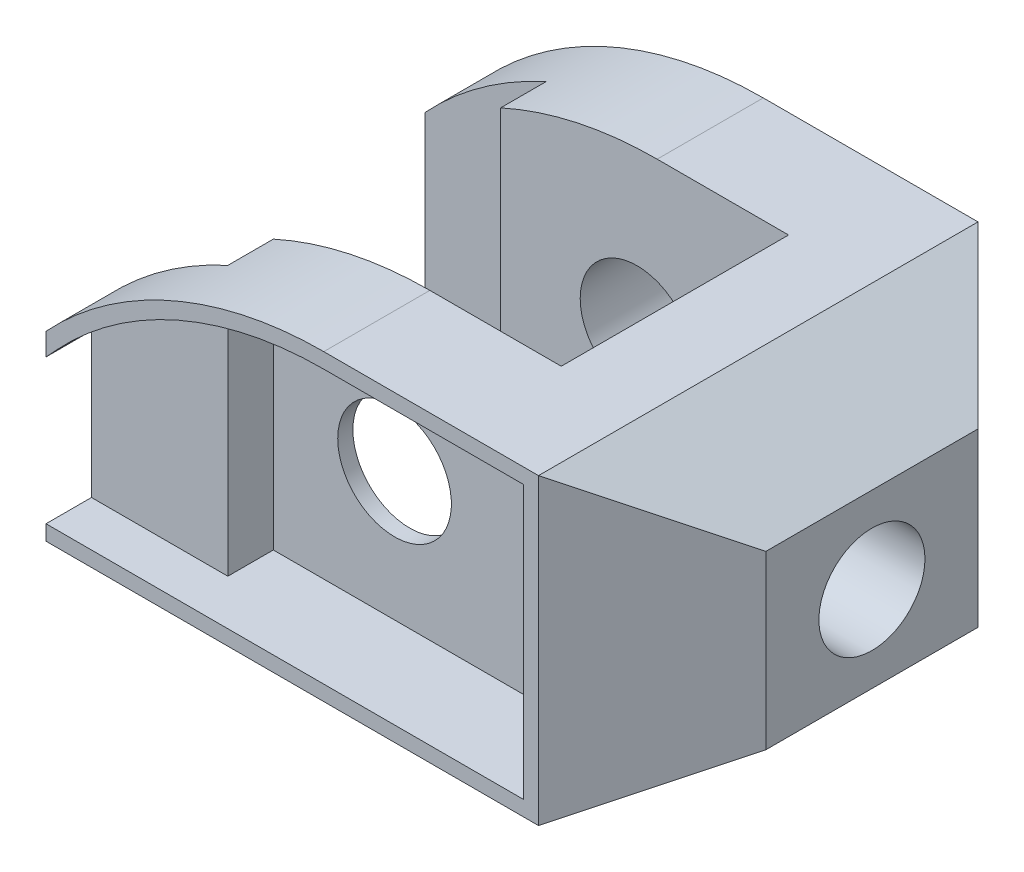
ISO-10303-21;
HEADER;
FILE_DESCRIPTION(('STEP AP214'),'2;1');
FILE_NAME('part.step','',(''),(''),'','','');
FILE_SCHEMA(('AUTOMOTIVE_DESIGN { 1 0 10303 214 1 1 1 1 }'));
ENDSEC;
DATA;
#1=APPLICATION_CONTEXT('core data for automotive mechanical design processes');
#2=APPLICATION_PROTOCOL_DEFINITION('international standard','automotive_design',2000,#1);
#3=PRODUCT_CONTEXT('',#1,'mechanical');
#4=PRODUCT('Part','Part','',(#3));
#5=PRODUCT_RELATED_PRODUCT_CATEGORY('part','',(#4));
#6=PRODUCT_DEFINITION_FORMATION('','',#4);
#7=PRODUCT_DEFINITION_CONTEXT('part definition',#1,'design');
#8=PRODUCT_DEFINITION('design','',#6,#7);
#9=PRODUCT_DEFINITION_SHAPE('','',#8);
#10=(LENGTH_UNIT() NAMED_UNIT(*) SI_UNIT(.MILLI.,.METRE.));
#11=(NAMED_UNIT(*) PLANE_ANGLE_UNIT() SI_UNIT($,.RADIAN.));
#12=(NAMED_UNIT(*) SI_UNIT($,.STERADIAN.) SOLID_ANGLE_UNIT());
#13=UNCERTAINTY_MEASURE_WITH_UNIT(LENGTH_MEASURE(1.E-05),#10,'distance_accuracy_value','');
#14=(GEOMETRIC_REPRESENTATION_CONTEXT(3) GLOBAL_UNCERTAINTY_ASSIGNED_CONTEXT((#13)) GLOBAL_UNIT_ASSIGNED_CONTEXT((#10,
#11,#12)) REPRESENTATION_CONTEXT('',''));
#15=CARTESIAN_POINT('',(0.,0.,0.));
#16=DIRECTION('',(0.,0.,1.));
#17=DIRECTION('',(1.,0.,0.));
#18=AXIS2_PLACEMENT_3D('',#15,#16,#17);
#19=CARTESIAN_POINT('',(36.6606055596467,-10.,58.));
#20=DIRECTION('',(0.,0.,-1.));
#21=DIRECTION('',(-1.,0.,0.));
#22=AXIS2_PLACEMENT_3D('',#19,#20,#21);
#23=PLANE('',#22);
#24=DIRECTION('',(1.,0.,0.));
#25=VECTOR('',#24,1.);
#26=CARTESIAN_POINT('',(0.,2.,58.));
#27=LINE('',#26,#25);
#28=CARTESIAN_POINT('',(0.,2.,58.));
#29=VERTEX_POINT('',#28);
#30=CARTESIAN_POINT('',(63.,2.,58.));
#31=VERTEX_POINT('',#30);
#32=EDGE_CURVE('E253',#29,#31,#27,.T.);
#33=ORIENTED_EDGE('',*,*,#32,.F.);
#34=DIRECTION('',(0.,-1.,0.));
#35=VECTOR('',#34,1.);
#36=CARTESIAN_POINT('',(0.,0.,58.));
#37=LINE('',#36,#35);
#38=CARTESIAN_POINT('',(0.,0.,58.));
#39=VERTEX_POINT('',#38);
#40=EDGE_CURVE('E348',#29,#39,#37,.T.);
#41=ORIENTED_EDGE('',*,*,#40,.T.);
#42=DIRECTION('',(1.,0.,0.));
#43=VECTOR('',#42,1.);
#44=CARTESIAN_POINT('',(0.,0.,58.));
#45=LINE('',#44,#43);
#46=CARTESIAN_POINT('',(65.,0.,58.));
#47=VERTEX_POINT('',#46);
#48=EDGE_CURVE('E347',#39,#47,#45,.T.);
#49=ORIENTED_EDGE('',*,*,#48,.T.);
#50=DIRECTION('',(0.,-1.,0.));
#51=VECTOR('',#50,1.);
#52=CARTESIAN_POINT('',(65.,40.,58.));
#53=LINE('',#52,#51);
#54=CARTESIAN_POINT('',(65.,40.,58.));
#55=VERTEX_POINT('',#54);
#56=EDGE_CURVE('E327',#55,#47,#53,.T.);
#57=ORIENTED_EDGE('',*,*,#56,.F.);
#58=DIRECTION('',(-1.,0.,0.));
#59=VECTOR('',#58,1.);
#60=CARTESIAN_POINT('',(65.,40.,58.));
#61=LINE('',#60,#59);
#62=CARTESIAN_POINT('',(36.6606055596467,40.,58.));
#63=VERTEX_POINT('',#62);
#64=EDGE_CURVE('E351',#55,#63,#61,.T.);
#65=ORIENTED_EDGE('',*,*,#64,.T.);
#66=CARTESIAN_POINT('',(36.6606055596467,-10.,58.));
#67=DIRECTION('',(0.,0.,1.));
#68=DIRECTION('',(-1.,0.,0.));
#69=AXIS2_PLACEMENT_3D('',#66,#67,#68);
#70=CIRCLE('',#69,50.);
#71=CARTESIAN_POINT('',(0.,24.,58.));
#72=VERTEX_POINT('',#71);
#73=EDGE_CURVE('E353',#63,#72,#70,.T.);
#74=ORIENTED_EDGE('',*,*,#73,.T.);
#75=CARTESIAN_POINT('',(0.,21.0588235294118,58.));
#76=VERTEX_POINT('',#75);
#77=EDGE_CURVE('E344',#72,#76,#37,.T.);
#78=ORIENTED_EDGE('',*,*,#77,.T.);
#79=DIRECTION('',(-0.680000000000001,-0.733212111192934,0.));
#80=VECTOR('',#79,1.);
#81=CARTESIAN_POINT('',(-10.4995974322828,9.73760000000002,58.));
#82=LINE('',#81,#80);
#83=CARTESIAN_POINT('',(1.46642422238587,22.64,58.));
#84=VERTEX_POINT('',#83);
#85=EDGE_CURVE('E221',#84,#76,#82,.T.);
#86=ORIENTED_EDGE('',*,*,#85,.F.);
#87=CARTESIAN_POINT('',(36.6606055596467,-10.,58.));
#88=DIRECTION('',(0.,0.,1.));
#89=DIRECTION('',(1.,0.,0.));
#90=AXIS2_PLACEMENT_3D('',#87,#88,#89);
#91=CIRCLE('',#90,48.);
#92=CARTESIAN_POINT('',(36.6606055596467,38.,58.));
#93=VERTEX_POINT('',#92);
#94=EDGE_CURVE('E205',#93,#84,#91,.T.);
#95=ORIENTED_EDGE('',*,*,#94,.F.);
#96=DIRECTION('',(-1.,0.,0.));
#97=VECTOR('',#96,1.);
#98=CARTESIAN_POINT('',(0.,38.,58.));
#99=LINE('',#98,#97);
#100=CARTESIAN_POINT('',(63.,38.,58.));
#101=VERTEX_POINT('',#100);
#102=EDGE_CURVE('E61',#101,#93,#99,.T.);
#103=ORIENTED_EDGE('',*,*,#102,.F.);
#104=DIRECTION('',(0.,1.,0.));
#105=VECTOR('',#104,1.);
#106=CARTESIAN_POINT('',(63.,0.,58.));
#107=LINE('',#106,#105);
#108=EDGE_CURVE('E235',#31,#101,#107,.T.);
#109=ORIENTED_EDGE('',*,*,#108,.F.);
#110=EDGE_LOOP('',(#33,#41,#49,#57,#65,#74,#78,#86,#95,#103,#109));
#111=FACE_BOUND('',#110,.T.);
#112=ADVANCED_FACE('F38',(#111),#23,.F.);
#113=CARTESIAN_POINT('',(0.,0.,58.));
#114=DIRECTION('',(1.,0.,0.));
#115=DIRECTION('',(0.,0.,-1.));
#116=AXIS2_PLACEMENT_3D('',#113,#114,#115);
#117=PLANE('',#116);
#118=DIRECTION('',(0.,0.,1.));
#119=VECTOR('',#118,1.);
#120=CARTESIAN_POINT('',(0.,2.,52.));
#121=LINE('',#120,#119);
#122=CARTESIAN_POINT('',(0.,2.,52.));
#123=VERTEX_POINT('',#122);
#124=EDGE_CURVE('E227',#123,#29,#121,.T.);
#125=ORIENTED_EDGE('',*,*,#124,.F.);
#126=DIRECTION('',(0.,-1.,0.));
#127=VECTOR('',#126,1.);
#128=CARTESIAN_POINT('',(0.,0.,52.));
#129=LINE('',#128,#127);
#130=CARTESIAN_POINT('',(0.,21.0588235294118,52.));
#131=VERTEX_POINT('',#130);
#132=EDGE_CURVE('E217',#131,#123,#129,.T.);
#133=ORIENTED_EDGE('',*,*,#132,.F.);
#134=DIRECTION('',(0.,0.,1.));
#135=VECTOR('',#134,1.);
#136=CARTESIAN_POINT('',(0.,21.0588235294118,52.));
#137=LINE('',#136,#135);
#138=EDGE_CURVE('E208',#131,#76,#137,.T.);
#139=ORIENTED_EDGE('',*,*,#138,.T.);
#140=ORIENTED_EDGE('',*,*,#77,.F.);
#141=DIRECTION('',(0.,0.,-1.));
#142=VECTOR('',#141,1.);
#143=CARTESIAN_POINT('',(0.,24.,58.));
#144=LINE('',#143,#142);
#145=CARTESIAN_POINT('',(0.,24.,50.));
#146=VERTEX_POINT('',#145);
#147=EDGE_CURVE('E367',#72,#146,#144,.T.);
#148=ORIENTED_EDGE('',*,*,#147,.T.);
#149=DIRECTION('',(0.,1.,0.));
#150=VECTOR('',#149,1.);
#151=CARTESIAN_POINT('',(0.,0.,50.));
#152=LINE('',#151,#150);
#153=CARTESIAN_POINT('',(0.,0.,50.));
#154=VERTEX_POINT('',#153);
#155=EDGE_CURVE('E301',#154,#146,#152,.T.);
#156=ORIENTED_EDGE('',*,*,#155,.F.);
#157=DIRECTION('',(0.,0.,-1.));
#158=VECTOR('',#157,1.);
#159=CARTESIAN_POINT('',(0.,0.,58.));
#160=LINE('',#159,#158);
#161=EDGE_CURVE('E387',#39,#154,#160,.T.);
#162=ORIENTED_EDGE('',*,*,#161,.F.);
#163=ORIENTED_EDGE('',*,*,#40,.F.);
#164=EDGE_LOOP('',(#125,#133,#139,#140,#148,#156,#162,#163));
#165=FACE_BOUND('',#164,.T.);
#166=ADVANCED_FACE('F40',(#165),#117,.F.);
#167=CARTESIAN_POINT('',(18.,0.,46.));
#168=DIRECTION('',(-1.,0.,0.));
#169=DIRECTION('',(0.,-1.,0.));
#170=AXIS2_PLACEMENT_3D('',#167,#168,#169);
#171=PLANE('',#170);
#172=DIRECTION('',(0.,1.,0.));
#173=VECTOR('',#172,1.);
#174=CARTESIAN_POINT('',(18.,0.,52.));
#175=LINE('',#174,#173);
#176=CARTESIAN_POINT('',(18.,2.,52.));
#177=VERTEX_POINT('',#176);
#178=CARTESIAN_POINT('',(18.,34.2242218715862,52.));
#179=VERTEX_POINT('',#178);
#180=EDGE_CURVE('E53',#177,#179,#175,.T.);
#181=ORIENTED_EDGE('',*,*,#180,.F.);
#182=DIRECTION('',(0.,0.,1.));
#183=VECTOR('',#182,1.);
#184=CARTESIAN_POINT('',(18.,2.,46.));
#185=LINE('',#184,#183);
#186=CARTESIAN_POINT('',(18.,2.,46.));
#187=VERTEX_POINT('',#186);
#188=EDGE_CURVE('E263',#187,#177,#185,.T.);
#189=ORIENTED_EDGE('',*,*,#188,.F.);
#190=DIRECTION('',(0.,-1.,0.));
#191=VECTOR('',#190,1.);
#192=CARTESIAN_POINT('',(18.,0.,46.));
#193=LINE('',#192,#191);
#194=CARTESIAN_POINT('',(18.,34.2242218715862,46.));
#195=VERTEX_POINT('',#194);
#196=EDGE_CURVE('E241',#195,#187,#193,.T.);
#197=ORIENTED_EDGE('',*,*,#196,.F.);
#198=DIRECTION('',(0.,0.,1.));
#199=VECTOR('',#198,1.);
#200=CARTESIAN_POINT('',(18.,34.2242218715862,46.));
#201=LINE('',#200,#199);
#202=EDGE_CURVE('E266',#195,#179,#201,.T.);
#203=ORIENTED_EDGE('',*,*,#202,.T.);
#204=EDGE_LOOP('',(#181,#189,#197,#203));
#205=FACE_BOUND('',#204,.T.);
#206=ADVANCED_FACE('F447',(#205),#171,.F.);
#207=CARTESIAN_POINT('',(34.,19.,58.));
#208=DIRECTION('',(0.,0.,-1.));
#209=DIRECTION('',(-1.,0.,0.));
#210=AXIS2_PLACEMENT_3D('',#207,#208,#209);
#211=CYLINDRICAL_SURFACE('',#210,7.5);
#212=CARTESIAN_POINT('',(34.,19.,44.));
#213=DIRECTION('',(0.,0.,1.));
#214=DIRECTION('',(1.,0.,0.));
#215=AXIS2_PLACEMENT_3D('',#212,#213,#214);
#216=CIRCLE('',#215,7.5);
#217=CARTESIAN_POINT('',(26.5,19.,44.));
#218=VERTEX_POINT('',#217);
#219=EDGE_CURVE('E318',#218,#218,#216,.T.);
#220=CARTESIAN_POINT('',(34.,19.,46.));
#221=DIRECTION('',(0.,0.,1.));
#222=DIRECTION('',(1.,0.,0.));
#223=AXIS2_PLACEMENT_3D('',#220,#221,#222);
#224=CIRCLE('',#223,7.5);
#225=CARTESIAN_POINT('',(26.5,19.,46.));
#226=VERTEX_POINT('',#225);
#227=EDGE_CURVE('E231',#226,#226,#224,.F.);
#228=CARTESIAN_POINT('',(26.5,19.,44.));
#229=CARTESIAN_POINT('',(26.5,19.,44.0208333333333));
#230=CARTESIAN_POINT('',(26.5,19.,44.0416666666667));
#231=CARTESIAN_POINT('',(26.5,19.,44.0833333333333));
#232=CARTESIAN_POINT('',(26.5,19.,44.1041666666667));
#233=CARTESIAN_POINT('',(26.5,19.,44.1458333333333));
#234=CARTESIAN_POINT('',(26.5,19.,44.1666666666667));
#235=CARTESIAN_POINT('',(26.5,19.,44.2083333333333));
#236=CARTESIAN_POINT('',(26.5,19.,44.2291666666667));
#237=CARTESIAN_POINT('',(26.5,19.,44.2708333333333));
#238=CARTESIAN_POINT('',(26.5,19.,44.2916666666667));
#239=CARTESIAN_POINT('',(26.5,19.,44.3333333333333));
#240=CARTESIAN_POINT('',(26.5,19.,44.3541666666667));
#241=CARTESIAN_POINT('',(26.5,19.,44.3958333333333));
#242=CARTESIAN_POINT('',(26.5,19.,44.4166666666667));
#243=CARTESIAN_POINT('',(26.5,19.,44.4583333333333));
#244=CARTESIAN_POINT('',(26.5,19.,44.4791666666667));
#245=CARTESIAN_POINT('',(26.5,19.,44.5208333333333));
#246=CARTESIAN_POINT('',(26.5,19.,44.5416666666667));
#247=CARTESIAN_POINT('',(26.5,19.,44.5833333333333));
#248=CARTESIAN_POINT('',(26.5,19.,44.6041666666667));
#249=CARTESIAN_POINT('',(26.5,19.,44.6458333333333));
#250=CARTESIAN_POINT('',(26.5,19.,44.6666666666667));
#251=CARTESIAN_POINT('',(26.5,19.,44.7083333333333));
#252=CARTESIAN_POINT('',(26.5,19.,44.7291666666667));
#253=CARTESIAN_POINT('',(26.5,19.,44.7708333333333));
#254=CARTESIAN_POINT('',(26.5,19.,44.7916666666667));
#255=CARTESIAN_POINT('',(26.5,19.,44.8333333333333));
#256=CARTESIAN_POINT('',(26.5,19.,44.8541666666667));
#257=CARTESIAN_POINT('',(26.5,19.,44.8958333333333));
#258=CARTESIAN_POINT('',(26.5,19.,44.9166666666667));
#259=CARTESIAN_POINT('',(26.5,19.,44.9583333333333));
#260=CARTESIAN_POINT('',(26.5,19.,44.9791666666667));
#261=CARTESIAN_POINT('',(26.5,19.,45.0208333333333));
#262=CARTESIAN_POINT('',(26.5,19.,45.0416666666667));
#263=CARTESIAN_POINT('',(26.5,19.,45.0833333333333));
#264=CARTESIAN_POINT('',(26.5,19.,45.1041666666667));
#265=CARTESIAN_POINT('',(26.5,19.,45.1458333333333));
#266=CARTESIAN_POINT('',(26.5,19.,45.1666666666667));
#267=CARTESIAN_POINT('',(26.5,19.,45.2083333333333));
#268=CARTESIAN_POINT('',(26.5,19.,45.2291666666667));
#269=CARTESIAN_POINT('',(26.5,19.,45.2708333333333));
#270=CARTESIAN_POINT('',(26.5,19.,45.2916666666667));
#271=CARTESIAN_POINT('',(26.5,19.,45.3333333333333));
#272=CARTESIAN_POINT('',(26.5,19.,45.3541666666667));
#273=CARTESIAN_POINT('',(26.5,19.,45.3958333333333));
#274=CARTESIAN_POINT('',(26.5,19.,45.4166666666667));
#275=CARTESIAN_POINT('',(26.5,19.,45.4583333333333));
#276=CARTESIAN_POINT('',(26.5,19.,45.4791666666667));
#277=CARTESIAN_POINT('',(26.5,19.,45.5208333333333));
#278=CARTESIAN_POINT('',(26.5,19.,45.5416666666667));
#279=CARTESIAN_POINT('',(26.5,19.,45.5833333333333));
#280=CARTESIAN_POINT('',(26.5,19.,45.6041666666667));
#281=CARTESIAN_POINT('',(26.5,19.,45.6458333333333));
#282=CARTESIAN_POINT('',(26.5,19.,45.6666666666667));
#283=CARTESIAN_POINT('',(26.5,19.,45.7083333333333));
#284=CARTESIAN_POINT('',(26.5,19.,45.7291666666667));
#285=CARTESIAN_POINT('',(26.5,19.,45.7708333333333));
#286=CARTESIAN_POINT('',(26.5,19.,45.7916666666667));
#287=CARTESIAN_POINT('',(26.5,19.,45.8333333333333));
#288=CARTESIAN_POINT('',(26.5,19.,45.8541666666667));
#289=CARTESIAN_POINT('',(26.5,19.,45.8958333333333));
#290=CARTESIAN_POINT('',(26.5,19.,45.9166666666667));
#291=CARTESIAN_POINT('',(26.5,19.,45.9583333333333));
#292=CARTESIAN_POINT('',(26.5,19.,45.9791666666667));
#293=CARTESIAN_POINT('',(26.5,19.,46.));
#294=B_SPLINE_CURVE_WITH_KNOTS('',3,(#228,#229,#230,#231,#232,#233,#234,#235,#236,#237,#238,
#239,#240,#241,#242,#243,#244,#245,#246,#247,#248,#249,#250,#251,#252,#253,#254,#255,#256,#257,
#258,#259,#260,#261,#262,#263,#264,#265,#266,#267,#268,#269,#270,#271,#272,#273,#274,#275,#276,
#277,#278,#279,#280,#281,#282,#283,#284,#285,#286,#287,#288,#289,#290,#291,#292,#293),
.UNSPECIFIED.,.F.,.F.,(4,2,2,2,2,2,2,2,2,2,2,2,2,2,2,2,2,2,2,2,2,2,2,2,2,2,2,2,2,2,2,2,4),(0.,
0.0625000000000001,0.124999999999993,0.1875,0.249999999999993,0.312499999999993,
0.374999999999993,0.437499999999993,0.499999999999994,0.562499999999994,0.624999999999994,
0.687499999999987,0.749999999999994,0.812499999999987,0.874999999999987,0.937499999999987,
0.999999999999987,1.06249999999999,1.12499999999999,1.18749999999999,1.24999999999998,
1.31249999999999,1.37499999999998,1.43749999999998,1.49999999999998,1.56249999999998,
1.62499999999998,1.68749999999998,1.74999999999998,1.81249999999997,1.87499999999998,
1.93749999999997,1.99999999999997),.UNSPECIFIED.);
#295=EDGE_CURVE('BSEAM474',#218,#226,#294,.T.);
#296=ORIENTED_EDGE('',*,*,#219,.F.);
#297=ORIENTED_EDGE('',*,*,#227,.F.);
#298=ORIENTED_EDGE('',*,*,#295,.T.);
#299=ORIENTED_EDGE('',*,*,#295,.F.);
#300=EDGE_LOOP('',(#296,#298,#297,#299));
#301=FACE_BOUND('',#300,.T.);
#302=ADVANCED_FACE('F474',(#301),#211,.F.);
#303=DIRECTION('',(0.,1.,0.));
#304=VECTOR('',#303,1.);
#305=CARTESIAN_POINT('',(0.,0.,8.));
#306=LINE('',#305,#304);
#307=CARTESIAN_POINT('',(0.,0.,8.));
#308=VERTEX_POINT('',#307);
#309=CARTESIAN_POINT('',(0.,24.,8.));
#310=VERTEX_POINT('',#309);
#311=EDGE_CURVE('E303',#308,#310,#306,.T.);
#312=ORIENTED_EDGE('',*,*,#311,.T.);
#313=CARTESIAN_POINT('',(0.,24.,0.));
#314=VERTEX_POINT('',#313);
#315=EDGE_CURVE('E355',#310,#314,#144,.T.);
#316=ORIENTED_EDGE('',*,*,#315,.T.);
#317=DIRECTION('',(0.,-1.,0.));
#318=VECTOR('',#317,1.);
#319=CARTESIAN_POINT('',(0.,0.,0.));
#320=LINE('',#319,#318);
#321=CARTESIAN_POINT('',(0.,0.,0.));
#322=VERTEX_POINT('',#321);
#323=EDGE_CURVE('E343',#314,#322,#320,.T.);
#324=ORIENTED_EDGE('',*,*,#323,.T.);
#325=EDGE_CURVE('E386',#308,#322,#160,.T.);
#326=ORIENTED_EDGE('',*,*,#325,.F.);
#327=EDGE_LOOP('',(#312,#316,#324,#326));
#328=FACE_BOUND('',#327,.T.);
#329=ADVANCED_FACE('F471',(#328),#117,.F.);
#330=CARTESIAN_POINT('',(36.6606055596467,-10.,58.));
#331=DIRECTION('',(0.,0.,-1.));
#332=DIRECTION('',(-1.,0.,0.));
#333=AXIS2_PLACEMENT_3D('',#330,#331,#332);
#334=CYLINDRICAL_SURFACE('',#333,50.);
#335=CARTESIAN_POINT('',(36.6606055596467,-10.,8.));
#336=DIRECTION('',(0.,0.,1.));
#337=DIRECTION('',(1.,0.,0.));
#338=AXIS2_PLACEMENT_3D('',#335,#336,#337);
#339=CIRCLE('',#338,50.);
#340=CARTESIAN_POINT('',(16.,35.5317403347236,8.));
#341=VERTEX_POINT('',#340);
#342=EDGE_CURVE('E402',#341,#310,#339,.T.);
#343=ORIENTED_EDGE('',*,*,#342,.F.);
#344=DIRECTION('',(0.,0.,-1.));
#345=VECTOR('',#344,1.);
#346=CARTESIAN_POINT('',(16.,35.5317403347236,58.));
#347=LINE('',#346,#345);
#348=CARTESIAN_POINT('',(16.,35.5317403347236,14.));
#349=VERTEX_POINT('',#348);
#350=EDGE_CURVE('E394',#349,#341,#347,.T.);
#351=ORIENTED_EDGE('',*,*,#350,.F.);
#352=CARTESIAN_POINT('',(36.6606055596467,-10.,14.));
#353=DIRECTION('',(0.,0.,1.));
#354=DIRECTION('',(1.,0.,0.));
#355=AXIS2_PLACEMENT_3D('',#352,#353,#354);
#356=CIRCLE('',#355,50.);
#357=CARTESIAN_POINT('',(36.6606055596467,40.,14.));
#358=VERTEX_POINT('',#357);
#359=EDGE_CURVE('E316',#358,#349,#356,.T.);
#360=ORIENTED_EDGE('',*,*,#359,.F.);
#361=DIRECTION('',(0.,0.,-1.));
#362=VECTOR('',#361,1.);
#363=CARTESIAN_POINT('',(36.6606055596467,40.,58.));
#364=LINE('',#363,#362);
#365=CARTESIAN_POINT('',(36.6606055596467,40.,0.));
#366=VERTEX_POINT('',#365);
#367=EDGE_CURVE('E370',#358,#366,#364,.T.);
#368=ORIENTED_EDGE('',*,*,#367,.T.);
#369=CARTESIAN_POINT('',(36.6606055596467,-10.,0.));
#370=DIRECTION('',(0.,0.,1.));
#371=DIRECTION('',(-1.,0.,0.));
#372=AXIS2_PLACEMENT_3D('',#369,#370,#371);
#373=CIRCLE('',#372,50.);
#374=EDGE_CURVE('E364',#366,#314,#373,.T.);
#375=ORIENTED_EDGE('',*,*,#374,.T.);
#376=ORIENTED_EDGE('',*,*,#315,.F.);
#377=EDGE_LOOP('',(#343,#351,#360,#368,#375,#376));
#378=FACE_BOUND('',#377,.T.);
#379=ADVANCED_FACE('F485',(#378),#334,.T.);
#380=CARTESIAN_POINT('',(34.,19.,0.));
#381=DIRECTION('',(0.,0.,1.));
#382=DIRECTION('',(1.,0.,0.));
#383=AXIS2_PLACEMENT_3D('',#380,#381,#382);
#384=CIRCLE('',#383,7.5);
#385=CARTESIAN_POINT('',(26.5,19.,0.));
#386=VERTEX_POINT('',#385);
#387=EDGE_CURVE('E340',#386,#386,#384,.T.);
#388=CARTESIAN_POINT('',(34.,19.,14.));
#389=DIRECTION('',(0.,0.,1.));
#390=DIRECTION('',(1.,0.,0.));
#391=AXIS2_PLACEMENT_3D('',#388,#389,#390);
#392=CIRCLE('',#391,7.5);
#393=CARTESIAN_POINT('',(26.5,19.,14.));
#394=VERTEX_POINT('',#393);
#395=EDGE_CURVE('E319',#394,#394,#392,.T.);
#396=CARTESIAN_POINT('',(26.5,19.,0.));
#397=CARTESIAN_POINT('',(26.5,19.,0.145833333333333));
#398=CARTESIAN_POINT('',(26.5,19.,0.291666666666667));
#399=CARTESIAN_POINT('',(26.5,19.,0.583333333333334));
#400=CARTESIAN_POINT('',(26.5,19.,0.729166666666667));
#401=CARTESIAN_POINT('',(26.5,19.,1.02083333333333));
#402=CARTESIAN_POINT('',(26.5,19.,1.16666666666667));
#403=CARTESIAN_POINT('',(26.5,19.,1.45833333333333));
#404=CARTESIAN_POINT('',(26.5,19.,1.60416666666667));
#405=CARTESIAN_POINT('',(26.5,19.,1.89583333333334));
#406=CARTESIAN_POINT('',(26.5,19.,2.04166666666667));
#407=CARTESIAN_POINT('',(26.5,19.,2.33333333333334));
#408=CARTESIAN_POINT('',(26.5,19.,2.47916666666667));
#409=CARTESIAN_POINT('',(26.5,19.,2.77083333333334));
#410=CARTESIAN_POINT('',(26.5,19.,2.91666666666667));
#411=CARTESIAN_POINT('',(26.5,19.,3.20833333333334));
#412=CARTESIAN_POINT('',(26.5,19.,3.35416666666667));
#413=CARTESIAN_POINT('',(26.5,19.,3.64583333333334));
#414=CARTESIAN_POINT('',(26.5,19.,3.79166666666667));
#415=CARTESIAN_POINT('',(26.5,19.,4.08333333333334));
#416=CARTESIAN_POINT('',(26.5,19.,4.22916666666667));
#417=CARTESIAN_POINT('',(26.5,19.,4.52083333333334));
#418=CARTESIAN_POINT('',(26.5,19.,4.66666666666667));
#419=CARTESIAN_POINT('',(26.5,19.,4.95833333333334));
#420=CARTESIAN_POINT('',(26.5,19.,5.10416666666667));
#421=CARTESIAN_POINT('',(26.5,19.,5.39583333333334));
#422=CARTESIAN_POINT('',(26.5,19.,5.54166666666667));
#423=CARTESIAN_POINT('',(26.5,19.,5.83333333333334));
#424=CARTESIAN_POINT('',(26.5,19.,5.97916666666667));
#425=CARTESIAN_POINT('',(26.5,19.,6.27083333333334));
#426=CARTESIAN_POINT('',(26.5,19.,6.41666666666667));
#427=CARTESIAN_POINT('',(26.5,19.,6.70833333333334));
#428=CARTESIAN_POINT('',(26.5,19.,6.85416666666667));
#429=CARTESIAN_POINT('',(26.5,19.,7.14583333333334));
#430=CARTESIAN_POINT('',(26.5,19.,7.29166666666667));
#431=CARTESIAN_POINT('',(26.5,19.,7.58333333333334));
#432=CARTESIAN_POINT('',(26.5,19.,7.72916666666667));
#433=CARTESIAN_POINT('',(26.5,19.,8.02083333333334));
#434=CARTESIAN_POINT('',(26.5,19.,8.16666666666667));
#435=CARTESIAN_POINT('',(26.5,19.,8.45833333333334));
#436=CARTESIAN_POINT('',(26.5,19.,8.60416666666667));
#437=CARTESIAN_POINT('',(26.5,19.,8.89583333333334));
#438=CARTESIAN_POINT('',(26.5,19.,9.04166666666667));
#439=CARTESIAN_POINT('',(26.5,19.,9.33333333333334));
#440=CARTESIAN_POINT('',(26.5,19.,9.47916666666667));
#441=CARTESIAN_POINT('',(26.5,19.,9.77083333333334));
#442=CARTESIAN_POINT('',(26.5,19.,9.91666666666668));
#443=CARTESIAN_POINT('',(26.5,19.,10.2083333333333));
#444=CARTESIAN_POINT('',(26.5,19.,10.3541666666667));
#445=CARTESIAN_POINT('',(26.5,19.,10.6458333333333));
#446=CARTESIAN_POINT('',(26.5,19.,10.7916666666667));
#447=CARTESIAN_POINT('',(26.5,19.,11.0833333333333));
#448=CARTESIAN_POINT('',(26.5,19.,11.2291666666667));
#449=CARTESIAN_POINT('',(26.5,19.,11.5208333333333));
#450=CARTESIAN_POINT('',(26.5,19.,11.6666666666667));
#451=CARTESIAN_POINT('',(26.5,19.,11.9583333333333));
#452=CARTESIAN_POINT('',(26.5,19.,12.1041666666667));
#453=CARTESIAN_POINT('',(26.5,19.,12.3958333333333));
#454=CARTESIAN_POINT('',(26.5,19.,12.5416666666667));
#455=CARTESIAN_POINT('',(26.5,19.,12.8333333333333));
#456=CARTESIAN_POINT('',(26.5,19.,12.9791666666667));
#457=CARTESIAN_POINT('',(26.5,19.,13.2708333333333));
#458=CARTESIAN_POINT('',(26.5,19.,13.4166666666667));
#459=CARTESIAN_POINT('',(26.5,19.,13.7083333333333));
#460=CARTESIAN_POINT('',(26.5,19.,13.8541666666667));
#461=CARTESIAN_POINT('',(26.5,19.,14.));
#462=B_SPLINE_CURVE_WITH_KNOTS('',3,(#396,#397,#398,#399,#400,#401,#402,#403,#404,#405,#406,
#407,#408,#409,#410,#411,#412,#413,#414,#415,#416,#417,#418,#419,#420,#421,#422,#423,#424,#425,
#426,#427,#428,#429,#430,#431,#432,#433,#434,#435,#436,#437,#438,#439,#440,#441,#442,#443,#444,
#445,#446,#447,#448,#449,#450,#451,#452,#453,#454,#455,#456,#457,#458,#459,#460,#461),
.UNSPECIFIED.,.F.,.F.,(4,2,2,2,2,2,2,2,2,2,2,2,2,2,2,2,2,2,2,2,2,2,2,2,2,2,2,2,2,2,2,2,4),(0.,
0.4375,0.875000000000001,1.3125,1.75,2.1875,2.625,3.0625,3.5,3.9375,4.375,4.8125,5.25,
5.68750000000001,6.12500000000001,6.56250000000001,7.00000000000001,7.43750000000001,
7.87500000000001,8.31250000000001,8.75000000000001,9.18750000000001,9.62500000000001,10.0625,
10.5,10.9375,11.375,11.8125,12.25,12.6875,13.125,13.5625,14.),.UNSPECIFIED.);
#463=EDGE_CURVE('BSEAM673',#386,#394,#462,.T.);
#464=ORIENTED_EDGE('',*,*,#387,.F.);
#465=ORIENTED_EDGE('',*,*,#395,.T.);
#466=ORIENTED_EDGE('',*,*,#463,.T.);
#467=ORIENTED_EDGE('',*,*,#463,.F.);
#468=EDGE_LOOP('',(#464,#466,#465,#467));
#469=FACE_BOUND('',#468,.T.);
#470=ADVANCED_FACE('F673',(#469),#211,.F.);
#471=CARTESIAN_POINT('',(0.,20.,29.));
#472=DIRECTION('',(1.,0.,0.));
#473=DIRECTION('',(0.,0.,-1.));
#474=AXIS2_PLACEMENT_3D('',#471,#472,#473);
#475=CYLINDRICAL_SURFACE('',#474,7.);
#476=CARTESIAN_POINT('',(80.,20.,29.));
#477=DIRECTION('',(1.,0.,0.));
#478=DIRECTION('',(0.,0.,-1.));
#479=AXIS2_PLACEMENT_3D('',#476,#477,#478);
#480=CIRCLE('',#479,7.);
#481=CARTESIAN_POINT('',(80.,20.,22.));
#482=VERTEX_POINT('',#481);
#483=EDGE_CURVE('E323',#482,#482,#480,.T.);
#484=ORIENTED_EDGE('',*,*,#483,.T.);
#485=EDGE_LOOP('',(#484));
#486=FACE_BOUND('',#485,.T.);
#487=CARTESIAN_POINT('',(54.,20.,29.));
#488=DIRECTION('',(-1.,0.,0.));
#489=DIRECTION('',(0.,-1.,0.));
#490=AXIS2_PLACEMENT_3D('',#487,#488,#489);
#491=CIRCLE('',#490,7.);
#492=CARTESIAN_POINT('',(54.,13.,29.));
#493=VERTEX_POINT('',#492);
#494=EDGE_CURVE('E297',#493,#493,#491,.F.);
#495=ORIENTED_EDGE('',*,*,#494,.F.);
#496=EDGE_LOOP('',(#495));
#497=FACE_BOUND('',#496,.T.);
#498=ADVANCED_FACE('F480',(#486,#497),#475,.F.);
#499=CARTESIAN_POINT('',(36.6606055596467,-10.,0.));
#500=DIRECTION('',(0.,0.,-1.));
#501=DIRECTION('',(-1.,0.,0.));
#502=AXIS2_PLACEMENT_3D('',#499,#500,#501);
#503=PLANE('',#502);
#504=ORIENTED_EDGE('',*,*,#387,.T.);
#505=EDGE_LOOP('',(#504));
#506=FACE_BOUND('',#505,.T.);
#507=DIRECTION('',(-1.,0.,0.));
#508=VECTOR('',#507,1.);
#509=CARTESIAN_POINT('',(65.,40.,0.));
#510=LINE('',#509,#508);
#511=CARTESIAN_POINT('',(65.,40.,0.));
#512=VERTEX_POINT('',#511);
#513=EDGE_CURVE('E361',#512,#366,#510,.T.);
#514=ORIENTED_EDGE('',*,*,#513,.F.);
#515=DIRECTION('',(0.,-1.,0.));
#516=VECTOR('',#515,1.);
#517=CARTESIAN_POINT('',(65.,40.,0.));
#518=LINE('',#517,#516);
#519=CARTESIAN_POINT('',(65.,0.,0.));
#520=VERTEX_POINT('',#519);
#521=EDGE_CURVE('E326',#512,#520,#518,.T.);
#522=ORIENTED_EDGE('',*,*,#521,.T.);
#523=DIRECTION('',(1.,0.,0.));
#524=VECTOR('',#523,1.);
#525=CARTESIAN_POINT('',(0.,0.,0.));
#526=LINE('',#525,#524);
#527=EDGE_CURVE('E358',#322,#520,#526,.T.);
#528=ORIENTED_EDGE('',*,*,#527,.F.);
#529=ORIENTED_EDGE('',*,*,#323,.F.);
#530=ORIENTED_EDGE('',*,*,#374,.F.);
#531=EDGE_LOOP('',(#514,#522,#528,#529,#530));
#532=FACE_BOUND('',#531,.T.);
#533=ADVANCED_FACE('F476',(#506,#532),#503,.T.);
#534=CARTESIAN_POINT('',(65.,0.,58.));
#535=DIRECTION('',(-0.500000000000001,0.866025403784438,0.));
#536=DIRECTION('',(-0.866025403784438,-0.500000000000001,0.));
#537=AXIS2_PLACEMENT_3D('',#534,#535,#536);
#538=PLANE('',#537);
#539=DIRECTION('',(0.65465367070798,0.37796447300923,-0.654653670707972));
#540=VECTOR('',#539,1.);
#541=CARTESIAN_POINT('',(65.,0.,58.));
#542=LINE('',#541,#540);
#543=CARTESIAN_POINT('',(80.,8.66025403784441,43.0000000000002));
#544=VERTEX_POINT('',#543);
#545=EDGE_CURVE('E338',#47,#544,#542,.T.);
#546=ORIENTED_EDGE('',*,*,#545,.F.);
#547=DIRECTION('',(0.,0.,-1.));
#548=VECTOR('',#547,1.);
#549=CARTESIAN_POINT('',(65.,0.,58.));
#550=LINE('',#549,#548);
#551=EDGE_CURVE('E383',#47,#520,#550,.T.);
#552=ORIENTED_EDGE('',*,*,#551,.T.);
#553=DIRECTION('',(-0.654653670707976,-0.377964473009228,-0.654653670707979));
#554=VECTOR('',#553,1.);
#555=CARTESIAN_POINT('',(89.8571428571429,14.3512781198565,24.857142857143));
#556=LINE('',#555,#554);
#557=CARTESIAN_POINT('',(80.,8.66025403784441,15.0000000000001));
#558=VERTEX_POINT('',#557);
#559=EDGE_CURVE('E329',#558,#520,#556,.T.);
#560=ORIENTED_EDGE('',*,*,#559,.F.);
#561=DIRECTION('',(0.,0.,-1.));
#562=VECTOR('',#561,1.);
#563=CARTESIAN_POINT('',(80.,8.66025403784441,58.));
#564=LINE('',#563,#562);
#565=EDGE_CURVE('E380',#544,#558,#564,.T.);
#566=ORIENTED_EDGE('',*,*,#565,.F.);
#567=EDGE_LOOP('',(#546,#552,#560,#566));
#568=FACE_BOUND('',#567,.T.);
#569=ADVANCED_FACE('F479',(#568),#538,.F.);
#570=CARTESIAN_POINT('',(80.,8.66025403784441,58.));
#571=DIRECTION('',(-1.,0.,0.));
#572=DIRECTION('',(0.,0.,1.));
#573=AXIS2_PLACEMENT_3D('',#570,#571,#572);
#574=PLANE('',#573);
#575=ORIENTED_EDGE('',*,*,#483,.F.);
#576=EDGE_LOOP('',(#575));
#577=FACE_BOUND('',#576,.T.);
#578=DIRECTION('',(0.,-1.,0.));
#579=VECTOR('',#578,1.);
#580=CARTESIAN_POINT('',(80.,40.,43.0000000000002));
#581=LINE('',#580,#579);
#582=CARTESIAN_POINT('',(80.,31.3397459621556,43.0000000000002));
#583=VERTEX_POINT('',#582);
#584=EDGE_CURVE('E330',#583,#544,#581,.T.);
#585=ORIENTED_EDGE('',*,*,#584,.T.);
#586=ORIENTED_EDGE('',*,*,#565,.T.);
#587=DIRECTION('',(0.,-1.,0.));
#588=VECTOR('',#587,1.);
#589=CARTESIAN_POINT('',(80.,40.,15.0000000000001));
#590=LINE('',#589,#588);
#591=CARTESIAN_POINT('',(80.,31.3397459621556,15.0000000000001));
#592=VERTEX_POINT('',#591);
#593=EDGE_CURVE('E333',#592,#558,#590,.T.);
#594=ORIENTED_EDGE('',*,*,#593,.F.);
#595=DIRECTION('',(0.,0.,-1.));
#596=VECTOR('',#595,1.);
#597=CARTESIAN_POINT('',(80.,31.3397459621556,58.));
#598=LINE('',#597,#596);
#599=EDGE_CURVE('E377',#583,#592,#598,.T.);
#600=ORIENTED_EDGE('',*,*,#599,.F.);
#601=EDGE_LOOP('',(#585,#586,#594,#600));
#602=FACE_BOUND('',#601,.T.);
#603=ADVANCED_FACE('F491',(#577,#602),#574,.F.);
#604=CARTESIAN_POINT('',(80.,31.3397459621556,58.));
#605=DIRECTION('',(-0.500000000000001,-0.866025403784438,0.));
#606=DIRECTION('',(0.866025403784438,-0.500000000000001,0.));
#607=AXIS2_PLACEMENT_3D('',#604,#605,#606);
#608=PLANE('',#607);
#609=DIRECTION('',(-0.65465367070798,0.37796447300923,0.654653670707972));
#610=VECTOR('',#609,1.);
#611=CARTESIAN_POINT('',(73.5714285714287,35.051283406946,49.4285714285714));
#612=LINE('',#611,#610);
#613=EDGE_CURVE('E392',#583,#55,#612,.T.);
#614=ORIENTED_EDGE('',*,*,#613,.F.);
#615=ORIENTED_EDGE('',*,*,#599,.T.);
#616=DIRECTION('',(0.654653670707976,-0.377964473009228,0.654653670707979));
#617=VECTOR('',#616,1.);
#618=CARTESIAN_POINT('',(98.4285714285714,20.7000052870896,33.4285714285715));
#619=LINE('',#618,#617);
#620=EDGE_CURVE('E390',#512,#592,#619,.T.);
#621=ORIENTED_EDGE('',*,*,#620,.F.);
#622=DIRECTION('',(0.,0.,-1.));
#623=VECTOR('',#622,1.);
#624=CARTESIAN_POINT('',(65.,40.,58.));
#625=LINE('',#624,#623);
#626=EDGE_CURVE('E374',#55,#512,#625,.T.);
#627=ORIENTED_EDGE('',*,*,#626,.F.);
#628=EDGE_LOOP('',(#614,#615,#621,#627));
#629=FACE_BOUND('',#628,.T.);
#630=ADVANCED_FACE('F488',(#629),#608,.F.);
#631=CARTESIAN_POINT('',(0.,0.,58.));
#632=DIRECTION('',(0.,1.,0.));
#633=DIRECTION('',(0.,0.,1.));
#634=AXIS2_PLACEMENT_3D('',#631,#632,#633);
#635=PLANE('',#634);
#636=ORIENTED_EDGE('',*,*,#161,.T.);
#637=DIRECTION('',(1.,0.,0.));
#638=VECTOR('',#637,1.);
#639=CARTESIAN_POINT('',(0.,0.,50.));
#640=LINE('',#639,#638);
#641=CARTESIAN_POINT('',(16.,0.,50.));
#642=VERTEX_POINT('',#641);
#643=EDGE_CURVE('E281',#154,#642,#640,.T.);
#644=ORIENTED_EDGE('',*,*,#643,.T.);
#645=DIRECTION('',(0.,0.,-1.));
#646=VECTOR('',#645,1.);
#647=CARTESIAN_POINT('',(16.,0.,0.));
#648=LINE('',#647,#646);
#649=CARTESIAN_POINT('',(16.,0.,44.));
#650=VERTEX_POINT('',#649);
#651=EDGE_CURVE('E284',#642,#650,#648,.T.);
#652=ORIENTED_EDGE('',*,*,#651,.T.);
#653=DIRECTION('',(1.,0.,0.));
#654=VECTOR('',#653,1.);
#655=CARTESIAN_POINT('',(0.,0.,44.));
#656=LINE('',#655,#654);
#657=CARTESIAN_POINT('',(54.,0.,44.));
#658=VERTEX_POINT('',#657);
#659=EDGE_CURVE('E269',#650,#658,#656,.T.);
#660=ORIENTED_EDGE('',*,*,#659,.T.);
#661=DIRECTION('',(0.,0.,1.));
#662=VECTOR('',#661,1.);
#663=CARTESIAN_POINT('',(54.,0.,0.));
#664=LINE('',#663,#662);
#665=CARTESIAN_POINT('',(54.,0.,14.));
#666=VERTEX_POINT('',#665);
#667=EDGE_CURVE('E272',#666,#658,#664,.T.);
#668=ORIENTED_EDGE('',*,*,#667,.F.);
#669=DIRECTION('',(1.,0.,0.));
#670=VECTOR('',#669,1.);
#671=CARTESIAN_POINT('',(0.,0.,14.));
#672=LINE('',#671,#670);
#673=CARTESIAN_POINT('',(16.,0.,14.));
#674=VERTEX_POINT('',#673);
#675=EDGE_CURVE('E275',#674,#666,#672,.T.);
#676=ORIENTED_EDGE('',*,*,#675,.F.);
#677=DIRECTION('',(0.,0.,1.));
#678=VECTOR('',#677,1.);
#679=CARTESIAN_POINT('',(16.,0.,0.));
#680=LINE('',#679,#678);
#681=CARTESIAN_POINT('',(16.,0.,8.));
#682=VERTEX_POINT('',#681);
#683=EDGE_CURVE('E277',#682,#674,#680,.T.);
#684=ORIENTED_EDGE('',*,*,#683,.F.);
#685=DIRECTION('',(1.,0.,0.));
#686=VECTOR('',#685,1.);
#687=CARTESIAN_POINT('',(0.,0.,8.));
#688=LINE('',#687,#686);
#689=EDGE_CURVE('E279',#308,#682,#688,.T.);
#690=ORIENTED_EDGE('',*,*,#689,.F.);
#691=ORIENTED_EDGE('',*,*,#325,.T.);
#692=ORIENTED_EDGE('',*,*,#527,.T.);
#693=ORIENTED_EDGE('',*,*,#551,.F.);
#694=ORIENTED_EDGE('',*,*,#48,.F.);
#695=EDGE_LOOP('',(#636,#644,#652,#660,#668,#676,#684,#690,#691,#692,#693,#694));
#696=FACE_BOUND('',#695,.T.);
#697=ADVANCED_FACE('F433',(#696),#635,.F.);
#698=CARTESIAN_POINT('',(65.,40.,58.));
#699=DIRECTION('',(0.,-1.,0.));
#700=DIRECTION('',(1.,0.,0.));
#701=AXIS2_PLACEMENT_3D('',#698,#699,#700);
#702=PLANE('',#701);
#703=DIRECTION('',(0.,0.,1.));
#704=VECTOR('',#703,1.);
#705=CARTESIAN_POINT('',(54.,40.,0.));
#706=LINE('',#705,#704);
#707=CARTESIAN_POINT('',(54.,40.,14.));
#708=VERTEX_POINT('',#707);
#709=CARTESIAN_POINT('',(54.,40.,44.));
#710=VERTEX_POINT('',#709);
#711=EDGE_CURVE('E289',#708,#710,#706,.T.);
#712=ORIENTED_EDGE('',*,*,#711,.T.);
#713=DIRECTION('',(1.,0.,0.));
#714=VECTOR('',#713,1.);
#715=CARTESIAN_POINT('',(0.,40.,44.));
#716=LINE('',#715,#714);
#717=CARTESIAN_POINT('',(36.6606055596467,40.,44.));
#718=VERTEX_POINT('',#717);
#719=EDGE_CURVE('E260',#718,#710,#716,.T.);
#720=ORIENTED_EDGE('',*,*,#719,.F.);
#721=EDGE_CURVE('E371',#63,#718,#364,.T.);
#722=ORIENTED_EDGE('',*,*,#721,.F.);
#723=ORIENTED_EDGE('',*,*,#64,.F.);
#724=ORIENTED_EDGE('',*,*,#626,.T.);
#725=ORIENTED_EDGE('',*,*,#513,.T.);
#726=ORIENTED_EDGE('',*,*,#367,.F.);
#727=DIRECTION('',(1.,0.,0.));
#728=VECTOR('',#727,1.);
#729=CARTESIAN_POINT('',(0.,40.,14.));
#730=LINE('',#729,#728);
#731=EDGE_CURVE('E273',#358,#708,#730,.T.);
#732=ORIENTED_EDGE('',*,*,#731,.T.);
#733=EDGE_LOOP('',(#712,#720,#722,#723,#724,#725,#726,#732));
#734=FACE_BOUND('',#733,.T.);
#735=ADVANCED_FACE('F420',(#734),#702,.F.);
#736=ORIENTED_EDGE('',*,*,#721,.T.);
#737=CARTESIAN_POINT('',(36.6606055596467,-10.,44.));
#738=DIRECTION('',(0.,0.,1.));
#739=DIRECTION('',(1.,0.,0.));
#740=AXIS2_PLACEMENT_3D('',#737,#738,#739);
#741=CIRCLE('',#740,50.);
#742=CARTESIAN_POINT('',(16.,35.5317403347236,44.));
#743=VERTEX_POINT('',#742);
#744=EDGE_CURVE('E320',#718,#743,#741,.T.);
#745=ORIENTED_EDGE('',*,*,#744,.T.);
#746=DIRECTION('',(0.,0.,-1.));
#747=VECTOR('',#746,1.);
#748=CARTESIAN_POINT('',(16.,35.5317403347236,58.));
#749=LINE('',#748,#747);
#750=CARTESIAN_POINT('',(16.,35.5317403347236,50.));
#751=VERTEX_POINT('',#750);
#752=EDGE_CURVE('E12',#743,#751,#749,.F.);
#753=ORIENTED_EDGE('',*,*,#752,.T.);
#754=CARTESIAN_POINT('',(36.6606055596467,-10.,50.));
#755=DIRECTION('',(0.,0.,1.));
#756=DIRECTION('',(1.,0.,0.));
#757=AXIS2_PLACEMENT_3D('',#754,#755,#756);
#758=CIRCLE('',#757,50.);
#759=EDGE_CURVE('E46',#751,#146,#758,.T.);
#760=ORIENTED_EDGE('',*,*,#759,.T.);
#761=ORIENTED_EDGE('',*,*,#147,.F.);
#762=ORIENTED_EDGE('',*,*,#73,.F.);
#763=EDGE_LOOP('',(#736,#745,#753,#760,#761,#762));
#764=FACE_BOUND('',#763,.T.);
#765=ADVANCED_FACE('F406',(#764),#334,.T.);
#766=CARTESIAN_POINT('',(32.5000000000001,40.,-32.5));
#767=DIRECTION('',(0.707106781186549,0.,-0.707106781186546));
#768=DIRECTION('',(-0.707106781186546,0.,-0.707106781186549));
#769=AXIS2_PLACEMENT_3D('',#766,#767,#768);
#770=PLANE('',#769);
#771=ORIENTED_EDGE('',*,*,#559,.T.);
#772=ORIENTED_EDGE('',*,*,#521,.F.);
#773=ORIENTED_EDGE('',*,*,#620,.T.);
#774=ORIENTED_EDGE('',*,*,#593,.T.);
#775=EDGE_LOOP('',(#771,#772,#773,#774));
#776=FACE_BOUND('',#775,.T.);
#777=ADVANCED_FACE('F484',(#776),#770,.T.);
#778=CARTESIAN_POINT('',(61.4999999999996,40.,61.5000000000004));
#779=DIRECTION('',(0.707106781186543,0.,0.707106781186552));
#780=DIRECTION('',(0.707106781186552,0.,-0.707106781186543));
#781=AXIS2_PLACEMENT_3D('',#778,#779,#780);
#782=PLANE('',#781);
#783=ORIENTED_EDGE('',*,*,#545,.T.);
#784=ORIENTED_EDGE('',*,*,#584,.F.);
#785=ORIENTED_EDGE('',*,*,#613,.T.);
#786=ORIENTED_EDGE('',*,*,#56,.T.);
#787=EDGE_LOOP('',(#783,#784,#785,#786));
#788=FACE_BOUND('',#787,.T.);
#789=ADVANCED_FACE('F519',(#788),#782,.T.);
#790=CARTESIAN_POINT('',(16.,0.,0.));
#791=DIRECTION('',(1.,0.,0.));
#792=DIRECTION('',(0.,1.,0.));
#793=AXIS2_PLACEMENT_3D('',#790,#791,#792);
#794=PLANE('',#793);
#795=DIRECTION('',(0.,1.,0.));
#796=VECTOR('',#795,1.);
#797=CARTESIAN_POINT('',(16.,0.,44.));
#798=LINE('',#797,#796);
#799=EDGE_CURVE('E294',#650,#743,#798,.T.);
#800=ORIENTED_EDGE('',*,*,#799,.F.);
#801=ORIENTED_EDGE('',*,*,#651,.F.);
#802=DIRECTION('',(0.,1.,0.));
#803=VECTOR('',#802,1.);
#804=CARTESIAN_POINT('',(16.,0.,50.));
#805=LINE('',#804,#803);
#806=EDGE_CURVE('E298',#642,#751,#805,.T.);
#807=ORIENTED_EDGE('',*,*,#806,.T.);
#808=ORIENTED_EDGE('',*,*,#752,.F.);
#809=EDGE_LOOP('',(#800,#801,#807,#808));
#810=FACE_BOUND('',#809,.T.);
#811=ADVANCED_FACE('F437',(#810),#794,.F.);
#812=CARTESIAN_POINT('',(0.,0.,50.));
#813=DIRECTION('',(0.,0.,1.));
#814=DIRECTION('',(1.,0.,0.));
#815=AXIS2_PLACEMENT_3D('',#812,#813,#814);
#816=PLANE('',#815);
#817=ORIENTED_EDGE('',*,*,#806,.F.);
#818=ORIENTED_EDGE('',*,*,#643,.F.);
#819=ORIENTED_EDGE('',*,*,#155,.T.);
#820=ORIENTED_EDGE('',*,*,#759,.F.);
#821=EDGE_LOOP('',(#817,#818,#819,#820));
#822=FACE_BOUND('',#821,.T.);
#823=ADVANCED_FACE('F438',(#822),#816,.F.);
#824=CARTESIAN_POINT('',(0.,0.,8.));
#825=DIRECTION('',(0.,0.,1.));
#826=DIRECTION('',(1.,0.,0.));
#827=AXIS2_PLACEMENT_3D('',#824,#825,#826);
#828=PLANE('',#827);
#829=ORIENTED_EDGE('',*,*,#342,.T.);
#830=ORIENTED_EDGE('',*,*,#311,.F.);
#831=ORIENTED_EDGE('',*,*,#689,.T.);
#832=DIRECTION('',(0.,1.,0.));
#833=VECTOR('',#832,1.);
#834=CARTESIAN_POINT('',(16.,0.,8.));
#835=LINE('',#834,#833);
#836=EDGE_CURVE('E306',#682,#341,#835,.T.);
#837=ORIENTED_EDGE('',*,*,#836,.T.);
#838=EDGE_LOOP('',(#829,#830,#831,#837));
#839=FACE_BOUND('',#838,.T.);
#840=ADVANCED_FACE('F539',(#839),#828,.T.);
#841=CARTESIAN_POINT('',(16.,0.,0.));
#842=DIRECTION('',(-1.,0.,0.));
#843=DIRECTION('',(0.,-1.,0.));
#844=AXIS2_PLACEMENT_3D('',#841,#842,#843);
#845=PLANE('',#844);
#846=ORIENTED_EDGE('',*,*,#350,.T.);
#847=ORIENTED_EDGE('',*,*,#836,.F.);
#848=ORIENTED_EDGE('',*,*,#683,.T.);
#849=DIRECTION('',(0.,1.,0.));
#850=VECTOR('',#849,1.);
#851=CARTESIAN_POINT('',(16.,0.,14.));
#852=LINE('',#851,#850);
#853=EDGE_CURVE('E309',#674,#349,#852,.T.);
#854=ORIENTED_EDGE('',*,*,#853,.T.);
#855=EDGE_LOOP('',(#846,#847,#848,#854));
#856=FACE_BOUND('',#855,.T.);
#857=ADVANCED_FACE('F546',(#856),#845,.T.);
#858=CARTESIAN_POINT('',(0.,0.,44.));
#859=DIRECTION('',(0.,0.,1.));
#860=DIRECTION('',(1.,0.,0.));
#861=AXIS2_PLACEMENT_3D('',#858,#859,#860);
#862=PLANE('',#861);
#863=ORIENTED_EDGE('',*,*,#219,.T.);
#864=EDGE_LOOP('',(#863));
#865=FACE_BOUND('',#864,.T.);
#866=ORIENTED_EDGE('',*,*,#719,.T.);
#867=DIRECTION('',(0.,1.,0.));
#868=VECTOR('',#867,1.);
#869=CARTESIAN_POINT('',(54.,0.,44.));
#870=LINE('',#869,#868);
#871=EDGE_CURVE('E287',#658,#710,#870,.T.);
#872=ORIENTED_EDGE('',*,*,#871,.F.);
#873=ORIENTED_EDGE('',*,*,#659,.F.);
#874=ORIENTED_EDGE('',*,*,#799,.T.);
#875=ORIENTED_EDGE('',*,*,#744,.F.);
#876=EDGE_LOOP('',(#866,#872,#873,#874,#875));
#877=FACE_BOUND('',#876,.T.);
#878=ADVANCED_FACE('F424',(#865,#877),#862,.F.);
#879=CARTESIAN_POINT('',(0.,0.,14.));
#880=DIRECTION('',(0.,0.,1.));
#881=DIRECTION('',(1.,0.,0.));
#882=AXIS2_PLACEMENT_3D('',#879,#880,#881);
#883=PLANE('',#882);
#884=ORIENTED_EDGE('',*,*,#395,.F.);
#885=EDGE_LOOP('',(#884));
#886=FACE_BOUND('',#885,.T.);
#887=ORIENTED_EDGE('',*,*,#359,.T.);
#888=ORIENTED_EDGE('',*,*,#853,.F.);
#889=ORIENTED_EDGE('',*,*,#675,.T.);
#890=DIRECTION('',(0.,1.,0.));
#891=VECTOR('',#890,1.);
#892=CARTESIAN_POINT('',(54.,0.,14.));
#893=LINE('',#892,#891);
#894=EDGE_CURVE('E312',#666,#708,#893,.T.);
#895=ORIENTED_EDGE('',*,*,#894,.T.);
#896=ORIENTED_EDGE('',*,*,#731,.F.);
#897=EDGE_LOOP('',(#887,#888,#889,#895,#896));
#898=FACE_BOUND('',#897,.T.);
#899=ADVANCED_FACE('F561',(#886,#898),#883,.T.);
#900=CARTESIAN_POINT('',(54.,0.,0.));
#901=DIRECTION('',(-1.,0.,0.));
#902=DIRECTION('',(0.,-1.,0.));
#903=AXIS2_PLACEMENT_3D('',#900,#901,#902);
#904=PLANE('',#903);
#905=ORIENTED_EDGE('',*,*,#711,.F.);
#906=ORIENTED_EDGE('',*,*,#894,.F.);
#907=ORIENTED_EDGE('',*,*,#667,.T.);
#908=ORIENTED_EDGE('',*,*,#871,.T.);
#909=EDGE_LOOP('',(#905,#906,#907,#908));
#910=FACE_BOUND('',#909,.T.);
#911=ORIENTED_EDGE('',*,*,#494,.T.);
#912=EDGE_LOOP('',(#911));
#913=FACE_BOUND('',#912,.T.);
#914=ADVANCED_FACE('F427',(#910,#913),#904,.T.);
#915=CARTESIAN_POINT('',(0.,38.,46.));
#916=DIRECTION('',(0.,1.,0.));
#917=DIRECTION('',(0.,0.,1.));
#918=AXIS2_PLACEMENT_3D('',#915,#916,#917);
#919=PLANE('',#918);
#920=ORIENTED_EDGE('',*,*,#102,.T.);
#921=DIRECTION('',(0.,0.,1.));
#922=VECTOR('',#921,1.);
#923=CARTESIAN_POINT('',(36.6606055596467,38.,46.));
#924=LINE('',#923,#922);
#925=CARTESIAN_POINT('',(36.6606055596467,38.,46.));
#926=VERTEX_POINT('',#925);
#927=EDGE_CURVE('E250',#926,#93,#924,.T.);
#928=ORIENTED_EDGE('',*,*,#927,.F.);
#929=DIRECTION('',(-1.,0.,0.));
#930=VECTOR('',#929,1.);
#931=CARTESIAN_POINT('',(0.,38.,46.));
#932=LINE('',#931,#930);
#933=CARTESIAN_POINT('',(63.,38.,46.));
#934=VERTEX_POINT('',#933);
#935=EDGE_CURVE('E234',#934,#926,#932,.T.);
#936=ORIENTED_EDGE('',*,*,#935,.F.);
#937=DIRECTION('',(0.,0.,1.));
#938=VECTOR('',#937,1.);
#939=CARTESIAN_POINT('',(63.,38.,46.));
#940=LINE('',#939,#938);
#941=EDGE_CURVE('E258',#934,#101,#940,.T.);
#942=ORIENTED_EDGE('',*,*,#941,.T.);
#943=EDGE_LOOP('',(#920,#928,#936,#942));
#944=FACE_BOUND('',#943,.T.);
#945=ADVANCED_FACE('F454',(#944),#919,.F.);
#946=CARTESIAN_POINT('',(63.,0.,46.));
#947=DIRECTION('',(1.,0.,0.));
#948=DIRECTION('',(0.,0.,-1.));
#949=AXIS2_PLACEMENT_3D('',#946,#947,#948);
#950=PLANE('',#949);
#951=ORIENTED_EDGE('',*,*,#108,.T.);
#952=ORIENTED_EDGE('',*,*,#941,.F.);
#953=DIRECTION('',(0.,1.,0.));
#954=VECTOR('',#953,1.);
#955=CARTESIAN_POINT('',(63.,0.,46.));
#956=LINE('',#955,#954);
#957=CARTESIAN_POINT('',(63.,2.,46.));
#958=VERTEX_POINT('',#957);
#959=EDGE_CURVE('E247',#958,#934,#956,.T.);
#960=ORIENTED_EDGE('',*,*,#959,.F.);
#961=DIRECTION('',(0.,0.,1.));
#962=VECTOR('',#961,1.);
#963=CARTESIAN_POINT('',(63.,2.,46.));
#964=LINE('',#963,#962);
#965=EDGE_CURVE('E261',#958,#31,#964,.T.);
#966=ORIENTED_EDGE('',*,*,#965,.T.);
#967=EDGE_LOOP('',(#951,#952,#960,#966));
#968=FACE_BOUND('',#967,.T.);
#969=ADVANCED_FACE('F456',(#968),#950,.F.);
#970=CARTESIAN_POINT('',(0.,2.,46.));
#971=DIRECTION('',(0.,-1.,0.));
#972=DIRECTION('',(0.,0.,-1.));
#973=AXIS2_PLACEMENT_3D('',#970,#971,#972);
#974=PLANE('',#973);
#975=ORIENTED_EDGE('',*,*,#32,.T.);
#976=ORIENTED_EDGE('',*,*,#965,.F.);
#977=DIRECTION('',(1.,0.,0.));
#978=VECTOR('',#977,1.);
#979=CARTESIAN_POINT('',(0.,2.,46.));
#980=LINE('',#979,#978);
#981=EDGE_CURVE('E244',#187,#958,#980,.T.);
#982=ORIENTED_EDGE('',*,*,#981,.F.);
#983=ORIENTED_EDGE('',*,*,#188,.T.);
#984=DIRECTION('',(-1.,0.,0.));
#985=VECTOR('',#984,1.);
#986=CARTESIAN_POINT('',(0.,2.,52.));
#987=LINE('',#986,#985);
#988=EDGE_CURVE('E209',#177,#123,#987,.T.);
#989=ORIENTED_EDGE('',*,*,#988,.T.);
#990=ORIENTED_EDGE('',*,*,#124,.T.);
#991=EDGE_LOOP('',(#975,#976,#982,#983,#989,#990));
#992=FACE_BOUND('',#991,.T.);
#993=ADVANCED_FACE('F444',(#992),#974,.F.);
#994=CARTESIAN_POINT('',(36.6606055596467,-10.,46.));
#995=DIRECTION('',(0.,0.,1.));
#996=DIRECTION('',(1.,0.,0.));
#997=AXIS2_PLACEMENT_3D('',#994,#995,#996);
#998=CYLINDRICAL_SURFACE('',#997,48.);
#999=ORIENTED_EDGE('',*,*,#94,.T.);
#1000=DIRECTION('',(0.,0.,1.));
#1001=VECTOR('',#1000,1.);
#1002=CARTESIAN_POINT('',(1.46642422238587,22.64,52.));
#1003=LINE('',#1002,#1001);
#1004=CARTESIAN_POINT('',(1.46642422238587,22.64,52.));
#1005=VERTEX_POINT('',#1004);
#1006=EDGE_CURVE('E199',#1005,#84,#1003,.T.);
#1007=ORIENTED_EDGE('',*,*,#1006,.F.);
#1008=CARTESIAN_POINT('',(36.6606055596467,-10.,52.));
#1009=DIRECTION('',(0.,0.,1.));
#1010=DIRECTION('',(1.,0.,0.));
#1011=AXIS2_PLACEMENT_3D('',#1008,#1009,#1010);
#1012=CIRCLE('',#1011,48.);
#1013=EDGE_CURVE('E202',#179,#1005,#1012,.T.);
#1014=ORIENTED_EDGE('',*,*,#1013,.F.);
#1015=ORIENTED_EDGE('',*,*,#202,.F.);
#1016=CARTESIAN_POINT('',(36.6606055596467,-10.,46.));
#1017=DIRECTION('',(0.,0.,1.));
#1018=DIRECTION('',(1.,0.,0.));
#1019=AXIS2_PLACEMENT_3D('',#1016,#1017,#1018);
#1020=CIRCLE('',#1019,48.);
#1021=EDGE_CURVE('E238',#926,#195,#1020,.T.);
#1022=ORIENTED_EDGE('',*,*,#1021,.F.);
#1023=ORIENTED_EDGE('',*,*,#927,.T.);
#1024=EDGE_LOOP('',(#999,#1007,#1014,#1015,#1022,#1023));
#1025=FACE_BOUND('',#1024,.T.);
#1026=ADVANCED_FACE('F201',(#1025),#998,.F.);
#1027=CARTESIAN_POINT('',(0.,0.,46.));
#1028=DIRECTION('',(0.,0.,1.));
#1029=DIRECTION('',(1.,0.,0.));
#1030=AXIS2_PLACEMENT_3D('',#1027,#1028,#1029);
#1031=PLANE('',#1030);
#1032=ORIENTED_EDGE('',*,*,#227,.T.);
#1033=EDGE_LOOP('',(#1032));
#1034=FACE_BOUND('',#1033,.T.);
#1035=ORIENTED_EDGE('',*,*,#935,.T.);
#1036=ORIENTED_EDGE('',*,*,#1021,.T.);
#1037=ORIENTED_EDGE('',*,*,#196,.T.);
#1038=ORIENTED_EDGE('',*,*,#981,.T.);
#1039=ORIENTED_EDGE('',*,*,#959,.T.);
#1040=EDGE_LOOP('',(#1035,#1036,#1037,#1038,#1039));
#1041=FACE_BOUND('',#1040,.T.);
#1042=ADVANCED_FACE('F452',(#1034,#1041),#1031,.T.);
#1043=CARTESIAN_POINT('',(-10.4995974322828,9.73760000000002,52.));
#1044=DIRECTION('',(-0.733212111192934,0.68,0.));
#1045=DIRECTION('',(-0.680000000000001,-0.733212111192934,0.));
#1046=AXIS2_PLACEMENT_3D('',#1043,#1044,#1045);
#1047=PLANE('',#1046);
#1048=ORIENTED_EDGE('',*,*,#85,.T.);
#1049=ORIENTED_EDGE('',*,*,#138,.F.);
#1050=DIRECTION('',(-0.680000000000001,-0.733212111192934,0.));
#1051=VECTOR('',#1050,1.);
#1052=CARTESIAN_POINT('',(-10.4995974322828,9.73760000000002,52.));
#1053=LINE('',#1052,#1051);
#1054=EDGE_CURVE('E212',#1005,#131,#1053,.T.);
#1055=ORIENTED_EDGE('',*,*,#1054,.F.);
#1056=ORIENTED_EDGE('',*,*,#1006,.T.);
#1057=EDGE_LOOP('',(#1048,#1049,#1055,#1056));
#1058=FACE_BOUND('',#1057,.T.);
#1059=ADVANCED_FACE('F213',(#1058),#1047,.F.);
#1060=CARTESIAN_POINT('',(0.,0.,52.));
#1061=DIRECTION('',(0.,0.,1.));
#1062=DIRECTION('',(1.,0.,0.));
#1063=AXIS2_PLACEMENT_3D('',#1060,#1061,#1062);
#1064=PLANE('',#1063);
#1065=ORIENTED_EDGE('',*,*,#180,.T.);
#1066=ORIENTED_EDGE('',*,*,#1013,.T.);
#1067=ORIENTED_EDGE('',*,*,#1054,.T.);
#1068=ORIENTED_EDGE('',*,*,#132,.T.);
#1069=ORIENTED_EDGE('',*,*,#988,.F.);
#1070=EDGE_LOOP('',(#1065,#1066,#1067,#1068,#1069));
#1071=FACE_BOUND('',#1070,.T.);
#1072=ADVANCED_FACE('F219',(#1071),#1064,.T.);
#1073=CLOSED_SHELL('',(#112,#166,#206,#302,#329,#379,#470,#498,#533,#569,#603,#630,#697,#735,
#765,#777,#789,#811,#823,#840,#857,#878,#899,#914,#945,#969,#993,#1026,#1042,#1059,#1072));
#1074=MANIFOLD_SOLID_BREP('B2',#1073);
#1075=ADVANCED_BREP_SHAPE_REPRESENTATION('',(#18,#1074),#14);
#1076=SHAPE_DEFINITION_REPRESENTATION(#9,#1075);
ENDSEC;
END-ISO-10303-21;
